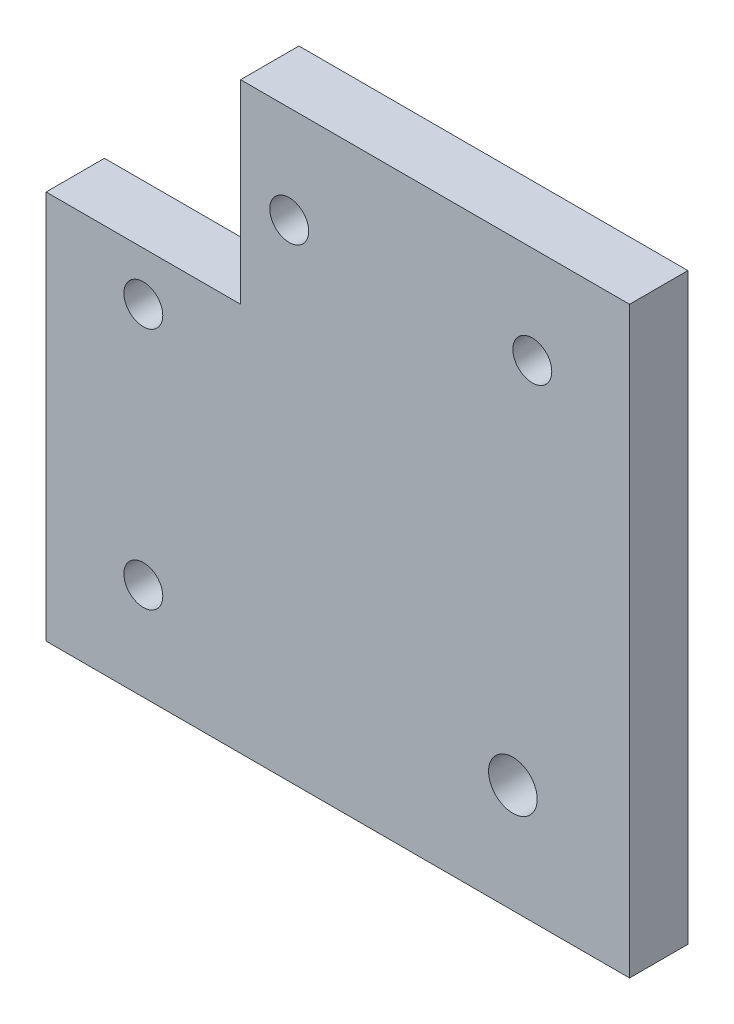
ISO-10303-21;
HEADER;
FILE_DESCRIPTION(('STEP AP214'),'2;1');
FILE_NAME('part.step','',(''),(''),'','','');
FILE_SCHEMA(('AUTOMOTIVE_DESIGN { 1 0 10303 214 1 1 1 1 }'));
ENDSEC;
DATA;
#1=APPLICATION_CONTEXT('core data for automotive mechanical design processes');
#2=APPLICATION_PROTOCOL_DEFINITION('international standard','automotive_design',2000,#1);
#3=PRODUCT_CONTEXT('',#1,'mechanical');
#4=PRODUCT('Part','Part','',(#3));
#5=PRODUCT_RELATED_PRODUCT_CATEGORY('part','',(#4));
#6=PRODUCT_DEFINITION_FORMATION('','',#4);
#7=PRODUCT_DEFINITION_CONTEXT('part definition',#1,'design');
#8=PRODUCT_DEFINITION('design','',#6,#7);
#9=PRODUCT_DEFINITION_SHAPE('','',#8);
#10=(LENGTH_UNIT() NAMED_UNIT(*) SI_UNIT(.MILLI.,.METRE.));
#11=(NAMED_UNIT(*) PLANE_ANGLE_UNIT() SI_UNIT($,.RADIAN.));
#12=(NAMED_UNIT(*) SI_UNIT($,.STERADIAN.) SOLID_ANGLE_UNIT());
#13=UNCERTAINTY_MEASURE_WITH_UNIT(LENGTH_MEASURE(1.E-05),#10,'distance_accuracy_value','');
#14=(GEOMETRIC_REPRESENTATION_CONTEXT(3) GLOBAL_UNCERTAINTY_ASSIGNED_CONTEXT((#13)) GLOBAL_UNIT_ASSIGNED_CONTEXT((#10,
#11,#12)) REPRESENTATION_CONTEXT('',''));
#15=CARTESIAN_POINT('',(0.,0.,0.));
#16=DIRECTION('',(0.,0.,1.));
#17=DIRECTION('',(1.,0.,0.));
#18=AXIS2_PLACEMENT_3D('',#15,#16,#17);
#19=CARTESIAN_POINT('',(0.,0.,6.));
#20=DIRECTION('',(0.,0.,-1.));
#21=DIRECTION('',(-1.,0.,0.));
#22=AXIS2_PLACEMENT_3D('',#19,#20,#21);
#23=PLANE('',#22);
#24=DIRECTION('',(1.,0.,0.));
#25=VECTOR('',#24,1.);
#26=CARTESIAN_POINT('',(0.,-60.,6.));
#27=LINE('',#26,#25);
#28=CARTESIAN_POINT('',(0.,-60.,6.));
#29=VERTEX_POINT('',#28);
#30=CARTESIAN_POINT('',(60.,-60.,6.));
#31=VERTEX_POINT('',#30);
#32=EDGE_CURVE('E83',#29,#31,#27,.T.);
#33=ORIENTED_EDGE('',*,*,#32,.T.);
#34=DIRECTION('',(0.,1.,0.));
#35=VECTOR('',#34,1.);
#36=CARTESIAN_POINT('',(60.,-20.,6.));
#37=LINE('',#36,#35);
#38=CARTESIAN_POINT('',(60.,0.,6.));
#39=VERTEX_POINT('',#38);
#40=EDGE_CURVE('E140',#31,#39,#37,.T.);
#41=ORIENTED_EDGE('',*,*,#40,.T.);
#42=DIRECTION('',(-1.,0.,0.));
#43=VECTOR('',#42,1.);
#44=CARTESIAN_POINT('',(29.3431457505079,0.,6.));
#45=LINE('',#44,#43);
#46=CARTESIAN_POINT('',(20.0000000000028,0.,6.));
#47=VERTEX_POINT('',#46);
#48=EDGE_CURVE('E98',#39,#47,#45,.T.);
#49=ORIENTED_EDGE('',*,*,#48,.T.);
#50=DIRECTION('',(0.,-1.,0.));
#51=VECTOR('',#50,1.);
#52=CARTESIAN_POINT('',(20.0000000000028,-20.0000000000028,6.));
#53=LINE('',#52,#51);
#54=CARTESIAN_POINT('',(20.0000000000028,-20.0000000000028,6.));
#55=VERTEX_POINT('',#54);
#56=EDGE_CURVE('E91',#47,#55,#53,.T.);
#57=ORIENTED_EDGE('',*,*,#56,.T.);
#58=DIRECTION('',(-1.,0.,0.));
#59=VECTOR('',#58,1.);
#60=CARTESIAN_POINT('',(20.0000000000028,-20.0000000000028,6.));
#61=LINE('',#60,#59);
#62=CARTESIAN_POINT('',(0.,-20.0000000000028,6.));
#63=VERTEX_POINT('',#62);
#64=EDGE_CURVE('E95',#55,#63,#61,.T.);
#65=ORIENTED_EDGE('',*,*,#64,.T.);
#66=DIRECTION('',(0.,-1.,0.));
#67=VECTOR('',#66,1.);
#68=CARTESIAN_POINT('',(0.,-29.3431457505076,6.));
#69=LINE('',#68,#67);
#70=EDGE_CURVE('E51',#63,#29,#69,.T.);
#71=ORIENTED_EDGE('',*,*,#70,.T.);
#72=EDGE_LOOP('',(#33,#41,#49,#57,#65,#71));
#73=FACE_BOUND('',#72,.T.);
#74=CARTESIAN_POINT('',(50.,-10.,6.));
#75=DIRECTION('',(0.,0.,1.));
#76=DIRECTION('',(1.,0.,0.));
#77=AXIS2_PLACEMENT_3D('',#74,#75,#76);
#78=CIRCLE('',#77,2.);
#79=CARTESIAN_POINT('',(52.,-10.,6.));
#80=VERTEX_POINT('',#79);
#81=EDGE_CURVE('E121',#80,#80,#78,.T.);
#82=ORIENTED_EDGE('',*,*,#81,.F.);
#83=EDGE_LOOP('',(#82));
#84=FACE_BOUND('',#83,.T.);
#85=CARTESIAN_POINT('',(25.,-10.,6.));
#86=DIRECTION('',(0.,0.,1.));
#87=DIRECTION('',(1.,0.,0.));
#88=AXIS2_PLACEMENT_3D('',#85,#86,#87);
#89=CIRCLE('',#88,2.);
#90=CARTESIAN_POINT('',(27.,-10.,6.));
#91=VERTEX_POINT('',#90);
#92=EDGE_CURVE('E205',#91,#91,#89,.T.);
#93=ORIENTED_EDGE('',*,*,#92,.F.);
#94=EDGE_LOOP('',(#93));
#95=FACE_BOUND('',#94,.T.);
#96=CARTESIAN_POINT('',(10.,-50.,6.));
#97=DIRECTION('',(0.,0.,1.));
#98=DIRECTION('',(1.,0.,0.));
#99=AXIS2_PLACEMENT_3D('',#96,#97,#98);
#100=CIRCLE('',#99,2.);
#101=CARTESIAN_POINT('',(12.,-50.,6.));
#102=VERTEX_POINT('',#101);
#103=EDGE_CURVE('E199',#102,#102,#100,.T.);
#104=ORIENTED_EDGE('',*,*,#103,.F.);
#105=EDGE_LOOP('',(#104));
#106=FACE_BOUND('',#105,.T.);
#107=CARTESIAN_POINT('',(10.,-25.,6.));
#108=DIRECTION('',(0.,0.,1.));
#109=DIRECTION('',(1.,0.,0.));
#110=AXIS2_PLACEMENT_3D('',#107,#108,#109);
#111=CIRCLE('',#110,2.);
#112=CARTESIAN_POINT('',(12.,-25.,6.));
#113=VERTEX_POINT('',#112);
#114=EDGE_CURVE('E193',#113,#113,#111,.T.);
#115=ORIENTED_EDGE('',*,*,#114,.F.);
#116=EDGE_LOOP('',(#115));
#117=FACE_BOUND('',#116,.T.);
#118=CARTESIAN_POINT('',(48.0000000002407,-48.833248844171,6.));
#119=DIRECTION('',(0.,0.,1.));
#120=DIRECTION('',(1.,0.,0.));
#121=AXIS2_PLACEMENT_3D('',#118,#119,#120);
#122=CIRCLE('',#121,2.5);
#123=CARTESIAN_POINT('',(50.5000000002407,-48.833248844171,6.));
#124=VERTEX_POINT('',#123);
#125=EDGE_CURVE('E184',#124,#124,#122,.T.);
#126=ORIENTED_EDGE('',*,*,#125,.F.);
#127=EDGE_LOOP('',(#126));
#128=FACE_BOUND('',#127,.T.);
#129=ADVANCED_FACE('F34',(#73,#84,#95,#106,#117,#128),#23,.F.);
#130=CARTESIAN_POINT('',(0.,0.,0.));
#131=DIRECTION('',(0.,0.,-1.));
#132=DIRECTION('',(-1.,0.,0.));
#133=AXIS2_PLACEMENT_3D('',#130,#131,#132);
#134=PLANE('',#133);
#135=CARTESIAN_POINT('',(10.,-25.,0.));
#136=DIRECTION('',(0.,0.,1.));
#137=DIRECTION('',(1.,0.,0.));
#138=AXIS2_PLACEMENT_3D('',#135,#136,#137);
#139=CIRCLE('',#138,2.);
#140=CARTESIAN_POINT('',(12.,-25.,0.));
#141=VERTEX_POINT('',#140);
#142=EDGE_CURVE('E190',#141,#141,#139,.T.);
#143=ORIENTED_EDGE('',*,*,#142,.T.);
#144=EDGE_LOOP('',(#143));
#145=FACE_BOUND('',#144,.T.);
#146=CARTESIAN_POINT('',(25.,-10.,0.));
#147=DIRECTION('',(0.,0.,1.));
#148=DIRECTION('',(1.,0.,0.));
#149=AXIS2_PLACEMENT_3D('',#146,#147,#148);
#150=CIRCLE('',#149,2.);
#151=CARTESIAN_POINT('',(27.,-10.,0.));
#152=VERTEX_POINT('',#151);
#153=EDGE_CURVE('E202',#152,#152,#150,.T.);
#154=ORIENTED_EDGE('',*,*,#153,.T.);
#155=EDGE_LOOP('',(#154));
#156=FACE_BOUND('',#155,.T.);
#157=DIRECTION('',(1.,0.,0.));
#158=VECTOR('',#157,1.);
#159=CARTESIAN_POINT('',(60.,-60.,0.));
#160=LINE('',#159,#158);
#161=CARTESIAN_POINT('',(0.,-60.,0.));
#162=VERTEX_POINT('',#161);
#163=CARTESIAN_POINT('',(60.,-60.,0.));
#164=VERTEX_POINT('',#163);
#165=EDGE_CURVE('E78',#162,#164,#160,.T.);
#166=ORIENTED_EDGE('',*,*,#165,.F.);
#167=DIRECTION('',(0.,-1.,0.));
#168=VECTOR('',#167,1.);
#169=CARTESIAN_POINT('',(0.,-29.3431457505076,0.));
#170=LINE('',#169,#168);
#171=CARTESIAN_POINT('',(0.,-20.0000000000028,0.));
#172=VERTEX_POINT('',#171);
#173=EDGE_CURVE('E74',#172,#162,#170,.T.);
#174=ORIENTED_EDGE('',*,*,#173,.F.);
#175=DIRECTION('',(-1.,0.,0.));
#176=VECTOR('',#175,1.);
#177=CARTESIAN_POINT('',(20.0000000000028,-20.0000000000028,0.));
#178=LINE('',#177,#176);
#179=CARTESIAN_POINT('',(20.0000000000028,-20.0000000000028,0.));
#180=VERTEX_POINT('',#179);
#181=EDGE_CURVE('E127',#180,#172,#178,.T.);
#182=ORIENTED_EDGE('',*,*,#181,.F.);
#183=DIRECTION('',(0.,-1.,0.));
#184=VECTOR('',#183,1.);
#185=CARTESIAN_POINT('',(20.0000000000028,-20.0000000000028,0.));
#186=LINE('',#185,#184);
#187=CARTESIAN_POINT('',(20.0000000000028,0.,0.));
#188=VERTEX_POINT('',#187);
#189=EDGE_CURVE('E107',#188,#180,#186,.T.);
#190=ORIENTED_EDGE('',*,*,#189,.F.);
#191=DIRECTION('',(-1.,0.,0.));
#192=VECTOR('',#191,1.);
#193=CARTESIAN_POINT('',(20.0000000000028,0.,0.));
#194=LINE('',#193,#192);
#195=CARTESIAN_POINT('',(60.,0.,0.));
#196=VERTEX_POINT('',#195);
#197=EDGE_CURVE('E124',#196,#188,#194,.T.);
#198=ORIENTED_EDGE('',*,*,#197,.F.);
#199=DIRECTION('',(0.,1.,0.));
#200=VECTOR('',#199,1.);
#201=CARTESIAN_POINT('',(60.,0.,0.));
#202=LINE('',#201,#200);
#203=EDGE_CURVE('E120',#164,#196,#202,.T.);
#204=ORIENTED_EDGE('',*,*,#203,.F.);
#205=EDGE_LOOP('',(#166,#174,#182,#190,#198,#204));
#206=FACE_BOUND('',#205,.T.);
#207=CARTESIAN_POINT('',(50.,-10.,0.));
#208=DIRECTION('',(0.,0.,1.));
#209=DIRECTION('',(1.,0.,0.));
#210=AXIS2_PLACEMENT_3D('',#207,#208,#209);
#211=CIRCLE('',#210,2.);
#212=CARTESIAN_POINT('',(52.,-10.,0.));
#213=VERTEX_POINT('',#212);
#214=EDGE_CURVE('E208',#213,#213,#211,.T.);
#215=ORIENTED_EDGE('',*,*,#214,.T.);
#216=EDGE_LOOP('',(#215));
#217=FACE_BOUND('',#216,.T.);
#218=CARTESIAN_POINT('',(10.,-50.,0.));
#219=DIRECTION('',(0.,0.,1.));
#220=DIRECTION('',(1.,0.,0.));
#221=AXIS2_PLACEMENT_3D('',#218,#219,#220);
#222=CIRCLE('',#221,2.);
#223=CARTESIAN_POINT('',(12.,-50.,0.));
#224=VERTEX_POINT('',#223);
#225=EDGE_CURVE('E196',#224,#224,#222,.T.);
#226=ORIENTED_EDGE('',*,*,#225,.T.);
#227=EDGE_LOOP('',(#226));
#228=FACE_BOUND('',#227,.T.);
#229=CARTESIAN_POINT('',(48.0000000002407,-48.833248844171,0.));
#230=DIRECTION('',(0.,0.,1.));
#231=DIRECTION('',(1.,0.,0.));
#232=AXIS2_PLACEMENT_3D('',#229,#230,#231);
#233=CIRCLE('',#232,2.5);
#234=CARTESIAN_POINT('',(50.5000000002407,-48.833248844171,0.));
#235=VERTEX_POINT('',#234);
#236=EDGE_CURVE('E187',#235,#235,#233,.T.);
#237=ORIENTED_EDGE('',*,*,#236,.T.);
#238=EDGE_LOOP('',(#237));
#239=FACE_BOUND('',#238,.T.);
#240=ADVANCED_FACE('F141',(#145,#156,#206,#217,#228,#239),#134,.T.);
#241=CARTESIAN_POINT('',(60.,-60.,6.));
#242=DIRECTION('',(0.,1.,0.));
#243=DIRECTION('',(0.,0.,1.));
#244=AXIS2_PLACEMENT_3D('',#241,#242,#243);
#245=PLANE('',#244);
#246=ORIENTED_EDGE('',*,*,#165,.T.);
#247=DIRECTION('',(0.,0.,-1.));
#248=VECTOR('',#247,1.);
#249=CARTESIAN_POINT('',(60.,-60.,6.));
#250=LINE('',#249,#248);
#251=EDGE_CURVE('E11',#31,#164,#250,.T.);
#252=ORIENTED_EDGE('',*,*,#251,.F.);
#253=ORIENTED_EDGE('',*,*,#32,.F.);
#254=DIRECTION('',(0.,0.,-1.));
#255=VECTOR('',#254,1.);
#256=CARTESIAN_POINT('',(0.,-60.,6.));
#257=LINE('',#256,#255);
#258=EDGE_CURVE('E115',#29,#162,#257,.T.);
#259=ORIENTED_EDGE('',*,*,#258,.T.);
#260=EDGE_LOOP('',(#246,#252,#253,#259));
#261=FACE_BOUND('',#260,.T.);
#262=ADVANCED_FACE('F36',(#261),#245,.F.);
#263=CARTESIAN_POINT('',(60.,0.,6.));
#264=DIRECTION('',(-1.,0.,0.));
#265=DIRECTION('',(0.,0.,1.));
#266=AXIS2_PLACEMENT_3D('',#263,#264,#265);
#267=PLANE('',#266);
#268=ORIENTED_EDGE('',*,*,#203,.T.);
#269=DIRECTION('',(0.,0.,-1.));
#270=VECTOR('',#269,1.);
#271=CARTESIAN_POINT('',(60.,0.,6.));
#272=LINE('',#271,#270);
#273=EDGE_CURVE('E43',#39,#196,#272,.T.);
#274=ORIENTED_EDGE('',*,*,#273,.F.);
#275=ORIENTED_EDGE('',*,*,#40,.F.);
#276=ORIENTED_EDGE('',*,*,#251,.T.);
#277=EDGE_LOOP('',(#268,#274,#275,#276));
#278=FACE_BOUND('',#277,.T.);
#279=ADVANCED_FACE('F139',(#278),#267,.F.);
#280=CARTESIAN_POINT('',(20.0000000000028,0.,6.));
#281=DIRECTION('',(0.,-1.,0.));
#282=DIRECTION('',(0.,0.,-1.));
#283=AXIS2_PLACEMENT_3D('',#280,#281,#282);
#284=PLANE('',#283);
#285=ORIENTED_EDGE('',*,*,#197,.T.);
#286=DIRECTION('',(0.,0.,-1.));
#287=VECTOR('',#286,1.);
#288=CARTESIAN_POINT('',(20.0000000000028,0.,6.));
#289=LINE('',#288,#287);
#290=EDGE_CURVE('E109',#47,#188,#289,.T.);
#291=ORIENTED_EDGE('',*,*,#290,.F.);
#292=ORIENTED_EDGE('',*,*,#48,.F.);
#293=ORIENTED_EDGE('',*,*,#273,.T.);
#294=EDGE_LOOP('',(#285,#291,#292,#293));
#295=FACE_BOUND('',#294,.T.);
#296=ADVANCED_FACE('F136',(#295),#284,.F.);
#297=CARTESIAN_POINT('',(20.0000000000028,-20.0000000000028,6.));
#298=DIRECTION('',(1.,0.,0.));
#299=DIRECTION('',(0.,0.,-1.));
#300=AXIS2_PLACEMENT_3D('',#297,#298,#299);
#301=PLANE('',#300);
#302=ORIENTED_EDGE('',*,*,#189,.T.);
#303=DIRECTION('',(0.,0.,-1.));
#304=VECTOR('',#303,1.);
#305=CARTESIAN_POINT('',(20.0000000000028,-20.0000000000028,6.));
#306=LINE('',#305,#304);
#307=EDGE_CURVE('E104',#55,#180,#306,.T.);
#308=ORIENTED_EDGE('',*,*,#307,.F.);
#309=ORIENTED_EDGE('',*,*,#56,.F.);
#310=ORIENTED_EDGE('',*,*,#290,.T.);
#311=EDGE_LOOP('',(#302,#308,#309,#310));
#312=FACE_BOUND('',#311,.T.);
#313=ADVANCED_FACE('F105',(#312),#301,.F.);
#314=CARTESIAN_POINT('',(20.0000000000028,-20.0000000000028,6.));
#315=DIRECTION('',(0.,-1.,0.));
#316=DIRECTION('',(0.,0.,-1.));
#317=AXIS2_PLACEMENT_3D('',#314,#315,#316);
#318=PLANE('',#317);
#319=ORIENTED_EDGE('',*,*,#181,.T.);
#320=DIRECTION('',(0.,0.,-1.));
#321=VECTOR('',#320,1.);
#322=CARTESIAN_POINT('',(0.,-20.0000000000028,6.));
#323=LINE('',#322,#321);
#324=EDGE_CURVE('E110',#63,#172,#323,.T.);
#325=ORIENTED_EDGE('',*,*,#324,.F.);
#326=ORIENTED_EDGE('',*,*,#64,.F.);
#327=ORIENTED_EDGE('',*,*,#307,.T.);
#328=EDGE_LOOP('',(#319,#325,#326,#327));
#329=FACE_BOUND('',#328,.T.);
#330=ADVANCED_FACE('F112',(#329),#318,.F.);
#331=CARTESIAN_POINT('',(0.,-29.3431457505076,6.));
#332=DIRECTION('',(1.,0.,0.));
#333=DIRECTION('',(0.,1.,0.));
#334=AXIS2_PLACEMENT_3D('',#331,#332,#333);
#335=PLANE('',#334);
#336=ORIENTED_EDGE('',*,*,#173,.T.);
#337=ORIENTED_EDGE('',*,*,#258,.F.);
#338=ORIENTED_EDGE('',*,*,#70,.F.);
#339=ORIENTED_EDGE('',*,*,#324,.T.);
#340=EDGE_LOOP('',(#336,#337,#338,#339));
#341=FACE_BOUND('',#340,.T.);
#342=ADVANCED_FACE('F145',(#341),#335,.F.);
#343=CARTESIAN_POINT('',(50.,-10.,6.));
#344=DIRECTION('',(0.,0.,-1.));
#345=DIRECTION('',(-1.,0.,0.));
#346=AXIS2_PLACEMENT_3D('',#343,#344,#345);
#347=CYLINDRICAL_SURFACE('',#346,2.);
#348=ORIENTED_EDGE('',*,*,#81,.T.);
#349=EDGE_LOOP('',(#348));
#350=FACE_BOUND('',#349,.T.);
#351=ORIENTED_EDGE('',*,*,#214,.F.);
#352=EDGE_LOOP('',(#351));
#353=FACE_BOUND('',#352,.T.);
#354=ADVANCED_FACE('F147',(#350,#353),#347,.F.);
#355=CARTESIAN_POINT('',(25.,-10.,6.));
#356=DIRECTION('',(0.,0.,-1.));
#357=DIRECTION('',(-1.,0.,0.));
#358=AXIS2_PLACEMENT_3D('',#355,#356,#357);
#359=CYLINDRICAL_SURFACE('',#358,2.);
#360=ORIENTED_EDGE('',*,*,#92,.T.);
#361=EDGE_LOOP('',(#360));
#362=FACE_BOUND('',#361,.T.);
#363=ORIENTED_EDGE('',*,*,#153,.F.);
#364=EDGE_LOOP('',(#363));
#365=FACE_BOUND('',#364,.T.);
#366=ADVANCED_FACE('F153',(#362,#365),#359,.F.);
#367=CARTESIAN_POINT('',(10.,-50.,6.));
#368=DIRECTION('',(0.,0.,-1.));
#369=DIRECTION('',(-1.,0.,0.));
#370=AXIS2_PLACEMENT_3D('',#367,#368,#369);
#371=CYLINDRICAL_SURFACE('',#370,2.);
#372=ORIENTED_EDGE('',*,*,#103,.T.);
#373=EDGE_LOOP('',(#372));
#374=FACE_BOUND('',#373,.T.);
#375=ORIENTED_EDGE('',*,*,#225,.F.);
#376=EDGE_LOOP('',(#375));
#377=FACE_BOUND('',#376,.T.);
#378=ADVANCED_FACE('F167',(#374,#377),#371,.F.);
#379=CARTESIAN_POINT('',(10.,-25.,6.));
#380=DIRECTION('',(0.,0.,-1.));
#381=DIRECTION('',(-1.,0.,0.));
#382=AXIS2_PLACEMENT_3D('',#379,#380,#381);
#383=CYLINDRICAL_SURFACE('',#382,2.);
#384=ORIENTED_EDGE('',*,*,#114,.T.);
#385=EDGE_LOOP('',(#384));
#386=FACE_BOUND('',#385,.T.);
#387=ORIENTED_EDGE('',*,*,#142,.F.);
#388=EDGE_LOOP('',(#387));
#389=FACE_BOUND('',#388,.T.);
#390=ADVANCED_FACE('F171',(#386,#389),#383,.F.);
#391=CARTESIAN_POINT('',(48.0000000002407,-48.833248844171,6.));
#392=DIRECTION('',(0.,0.,-1.));
#393=DIRECTION('',(-1.,0.,0.));
#394=AXIS2_PLACEMENT_3D('',#391,#392,#393);
#395=CYLINDRICAL_SURFACE('',#394,2.5);
#396=ORIENTED_EDGE('',*,*,#125,.T.);
#397=EDGE_LOOP('',(#396));
#398=FACE_BOUND('',#397,.T.);
#399=ORIENTED_EDGE('',*,*,#236,.F.);
#400=EDGE_LOOP('',(#399));
#401=FACE_BOUND('',#400,.T.);
#402=ADVANCED_FACE('F175',(#398,#401),#395,.F.);
#403=CLOSED_SHELL('',(#129,#240,#262,#279,#296,#313,#330,#342,#354,#366,#378,#390,#402));
#404=MANIFOLD_SOLID_BREP('B2',#403);
#405=ADVANCED_BREP_SHAPE_REPRESENTATION('',(#18,#404),#14);
#406=SHAPE_DEFINITION_REPRESENTATION(#9,#405);
ENDSEC;
END-ISO-10303-21;
